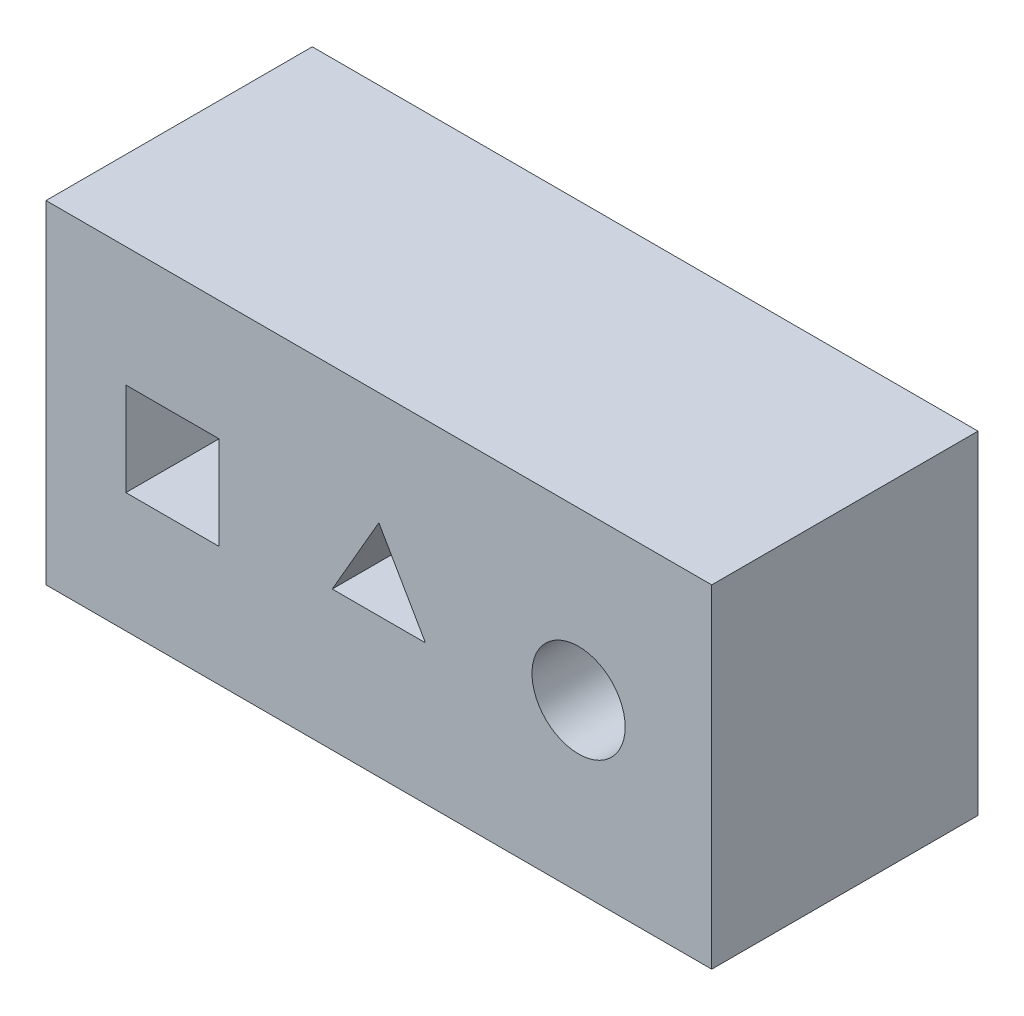
ISO-10303-21;
HEADER;
FILE_DESCRIPTION(('STEP AP214'),'2;1');
FILE_NAME('part.step','',(''),(''),'','','');
FILE_SCHEMA(('AUTOMOTIVE_DESIGN { 1 0 10303 214 1 1 1 1 }'));
ENDSEC;
DATA;
#1=APPLICATION_CONTEXT('core data for automotive mechanical design processes');
#2=APPLICATION_PROTOCOL_DEFINITION('international standard','automotive_design',2000,#1);
#3=PRODUCT_CONTEXT('',#1,'mechanical');
#4=PRODUCT('Part','Part','',(#3));
#5=PRODUCT_RELATED_PRODUCT_CATEGORY('part','',(#4));
#6=PRODUCT_DEFINITION_FORMATION('','',#4);
#7=PRODUCT_DEFINITION_CONTEXT('part definition',#1,'design');
#8=PRODUCT_DEFINITION('design','',#6,#7);
#9=PRODUCT_DEFINITION_SHAPE('','',#8);
#10=(LENGTH_UNIT() NAMED_UNIT(*) SI_UNIT(.MILLI.,.METRE.));
#11=(NAMED_UNIT(*) PLANE_ANGLE_UNIT() SI_UNIT($,.RADIAN.));
#12=(NAMED_UNIT(*) SI_UNIT($,.STERADIAN.) SOLID_ANGLE_UNIT());
#13=UNCERTAINTY_MEASURE_WITH_UNIT(LENGTH_MEASURE(1.E-05),#10,'distance_accuracy_value','');
#14=(GEOMETRIC_REPRESENTATION_CONTEXT(3) GLOBAL_UNCERTAINTY_ASSIGNED_CONTEXT((#13)) GLOBAL_UNIT_ASSIGNED_CONTEXT((#10,
#11,#12)) REPRESENTATION_CONTEXT('',''));
#15=CARTESIAN_POINT('',(0.,0.,0.));
#16=DIRECTION('',(0.,0.,1.));
#17=DIRECTION('',(1.,0.,0.));
#18=AXIS2_PLACEMENT_3D('',#15,#16,#17);
#19=CARTESIAN_POINT('',(0.,0.,100.));
#20=DIRECTION('',(0.,0.,1.));
#21=DIRECTION('',(1.,0.,0.));
#22=AXIS2_PLACEMENT_3D('',#19,#20,#21);
#23=PLANE('',#22);
#24=DIRECTION('',(0.,-1.,0.));
#25=VECTOR('',#24,1.);
#26=CARTESIAN_POINT('',(-125.,-62.5,100.));
#27=LINE('',#26,#25);
#28=CARTESIAN_POINT('',(-125.,62.5,100.));
#29=VERTEX_POINT('',#28);
#30=CARTESIAN_POINT('',(-125.,-62.5,100.));
#31=VERTEX_POINT('',#30);
#32=EDGE_CURVE('E204',#29,#31,#27,.T.);
#33=ORIENTED_EDGE('',*,*,#32,.T.);
#34=DIRECTION('',(1.,0.,0.));
#35=VECTOR('',#34,1.);
#36=CARTESIAN_POINT('',(125.,-62.5,100.));
#37=LINE('',#36,#35);
#38=CARTESIAN_POINT('',(125.,-62.5,100.));
#39=VERTEX_POINT('',#38);
#40=EDGE_CURVE('E92',#31,#39,#37,.T.);
#41=ORIENTED_EDGE('',*,*,#40,.T.);
#42=DIRECTION('',(0.,1.,0.));
#43=VECTOR('',#42,1.);
#44=CARTESIAN_POINT('',(125.,-62.5,100.));
#45=LINE('',#44,#43);
#46=CARTESIAN_POINT('',(125.,62.5,100.));
#47=VERTEX_POINT('',#46);
#48=EDGE_CURVE('E209',#39,#47,#45,.T.);
#49=ORIENTED_EDGE('',*,*,#48,.T.);
#50=DIRECTION('',(-1.,0.,0.));
#51=VECTOR('',#50,1.);
#52=CARTESIAN_POINT('',(125.,62.5,100.));
#53=LINE('',#52,#51);
#54=EDGE_CURVE('E61',#47,#29,#53,.T.);
#55=ORIENTED_EDGE('',*,*,#54,.T.);
#56=EDGE_LOOP('',(#33,#41,#49,#55));
#57=FACE_BOUND('',#56,.T.);
#58=CARTESIAN_POINT('',(74.9999999999999,0.,100.));
#59=DIRECTION('',(0.,0.,1.));
#60=DIRECTION('',(1.,0.,0.));
#61=AXIS2_PLACEMENT_3D('',#58,#59,#60);
#62=CIRCLE('',#61,17.5);
#63=CARTESIAN_POINT('',(92.4999999999999,0.,100.));
#64=VERTEX_POINT('',#63);
#65=EDGE_CURVE('E305',#64,#64,#62,.T.);
#66=ORIENTED_EDGE('',*,*,#65,.F.);
#67=EDGE_LOOP('',(#66));
#68=FACE_BOUND('',#67,.T.);
#69=DIRECTION('',(1.,0.,0.));
#70=VECTOR('',#69,1.);
#71=CARTESIAN_POINT('',(0.,17.5,100.));
#72=LINE('',#71,#70);
#73=CARTESIAN_POINT('',(-95.,17.5,100.));
#74=VERTEX_POINT('',#73);
#75=CARTESIAN_POINT('',(-60.,17.5,100.));
#76=VERTEX_POINT('',#75);
#77=EDGE_CURVE('E293',#74,#76,#72,.T.);
#78=ORIENTED_EDGE('',*,*,#77,.T.);
#79=DIRECTION('',(0.,-1.,0.));
#80=VECTOR('',#79,1.);
#81=CARTESIAN_POINT('',(-60.,0.,100.));
#82=LINE('',#81,#80);
#83=CARTESIAN_POINT('',(-60.,-17.5,100.));
#84=VERTEX_POINT('',#83);
#85=EDGE_CURVE('E289',#76,#84,#82,.T.);
#86=ORIENTED_EDGE('',*,*,#85,.T.);
#87=DIRECTION('',(1.,0.,0.));
#88=VECTOR('',#87,1.);
#89=CARTESIAN_POINT('',(0.,-17.5,100.));
#90=LINE('',#89,#88);
#91=CARTESIAN_POINT('',(-95.,-17.5,100.));
#92=VERTEX_POINT('',#91);
#93=EDGE_CURVE('E177',#92,#84,#90,.T.);
#94=ORIENTED_EDGE('',*,*,#93,.F.);
#95=DIRECTION('',(0.,-1.,0.));
#96=VECTOR('',#95,1.);
#97=CARTESIAN_POINT('',(-95.,0.,100.));
#98=LINE('',#97,#96);
#99=EDGE_CURVE('E182',#74,#92,#98,.T.);
#100=ORIENTED_EDGE('',*,*,#99,.F.);
#101=EDGE_LOOP('',(#78,#86,#94,#100));
#102=FACE_BOUND('',#101,.T.);
#103=DIRECTION('',(0.5,-0.866025403784439,0.));
#104=VECTOR('',#103,1.);
#105=CARTESIAN_POINT('',(8.75,5.05181485540923,100.));
#106=LINE('',#105,#104);
#107=CARTESIAN_POINT('',(0.,20.2072594216369,100.));
#108=VERTEX_POINT('',#107);
#109=CARTESIAN_POINT('',(17.5,-10.1036297108184,100.));
#110=VERTEX_POINT('',#109);
#111=EDGE_CURVE('E160',#108,#110,#106,.T.);
#112=ORIENTED_EDGE('',*,*,#111,.T.);
#113=DIRECTION('',(-1.,0.,0.));
#114=VECTOR('',#113,1.);
#115=CARTESIAN_POINT('',(0.,-10.1036297108184,100.));
#116=LINE('',#115,#114);
#117=CARTESIAN_POINT('',(-17.5,-10.1036297108184,100.));
#118=VERTEX_POINT('',#117);
#119=EDGE_CURVE('E284',#110,#118,#116,.T.);
#120=ORIENTED_EDGE('',*,*,#119,.T.);
#121=DIRECTION('',(0.5,0.866025403784439,0.));
#122=VECTOR('',#121,1.);
#123=CARTESIAN_POINT('',(-8.75,5.05181485540923,100.));
#124=LINE('',#123,#122);
#125=EDGE_CURVE('E148',#118,#108,#124,.T.);
#126=ORIENTED_EDGE('',*,*,#125,.T.);
#127=EDGE_LOOP('',(#112,#120,#126));
#128=FACE_BOUND('',#127,.T.);
#129=ADVANCED_FACE('F43',(#57,#68,#102,#128),#23,.T.);
#130=CARTESIAN_POINT('',(0.,0.,0.));
#131=DIRECTION('',(0.,0.,1.));
#132=DIRECTION('',(1.,0.,0.));
#133=AXIS2_PLACEMENT_3D('',#130,#131,#132);
#134=PLANE('',#133);
#135=DIRECTION('',(0.,-1.,0.));
#136=VECTOR('',#135,1.);
#137=CARTESIAN_POINT('',(-125.,-62.5,0.));
#138=LINE('',#137,#136);
#139=CARTESIAN_POINT('',(-125.,62.5,0.));
#140=VERTEX_POINT('',#139);
#141=CARTESIAN_POINT('',(-125.,-62.5,0.));
#142=VERTEX_POINT('',#141);
#143=EDGE_CURVE('E203',#140,#142,#138,.T.);
#144=ORIENTED_EDGE('',*,*,#143,.F.);
#145=DIRECTION('',(-1.,0.,0.));
#146=VECTOR('',#145,1.);
#147=CARTESIAN_POINT('',(125.,62.5,0.));
#148=LINE('',#147,#146);
#149=CARTESIAN_POINT('',(125.,62.5,0.));
#150=VERTEX_POINT('',#149);
#151=EDGE_CURVE('E85',#150,#140,#148,.T.);
#152=ORIENTED_EDGE('',*,*,#151,.F.);
#153=DIRECTION('',(0.,1.,0.));
#154=VECTOR('',#153,1.);
#155=CARTESIAN_POINT('',(125.,-62.5,0.));
#156=LINE('',#155,#154);
#157=CARTESIAN_POINT('',(125.,-62.5,0.));
#158=VERTEX_POINT('',#157);
#159=EDGE_CURVE('E79',#158,#150,#156,.T.);
#160=ORIENTED_EDGE('',*,*,#159,.F.);
#161=DIRECTION('',(1.,0.,0.));
#162=VECTOR('',#161,1.);
#163=CARTESIAN_POINT('',(125.,-62.5,0.));
#164=LINE('',#163,#162);
#165=EDGE_CURVE('E218',#142,#158,#164,.T.);
#166=ORIENTED_EDGE('',*,*,#165,.F.);
#167=EDGE_LOOP('',(#144,#152,#160,#166));
#168=FACE_BOUND('',#167,.T.);
#169=DIRECTION('',(-0.5,0.866025403784439,0.));
#170=VECTOR('',#169,1.);
#171=CARTESIAN_POINT('',(8.75,5.05181485540923,0.));
#172=LINE('',#171,#170);
#173=CARTESIAN_POINT('',(17.5,-10.1036297108184,0.));
#174=VERTEX_POINT('',#173);
#175=CARTESIAN_POINT('',(0.,20.2072594216369,0.));
#176=VERTEX_POINT('',#175);
#177=EDGE_CURVE('E136',#174,#176,#172,.T.);
#178=ORIENTED_EDGE('',*,*,#177,.T.);
#179=DIRECTION('',(-0.5,-0.866025403784439,0.));
#180=VECTOR('',#179,1.);
#181=CARTESIAN_POINT('',(-8.75,5.05181485540923,0.));
#182=LINE('',#181,#180);
#183=CARTESIAN_POINT('',(-17.5,-10.1036297108184,-1.11022302462516E-13));
#184=VERTEX_POINT('',#183);
#185=EDGE_CURVE('E140',#176,#184,#182,.T.);
#186=ORIENTED_EDGE('',*,*,#185,.T.);
#187=DIRECTION('',(1.,0.,0.));
#188=VECTOR('',#187,1.);
#189=CARTESIAN_POINT('',(0.,-10.1036297108184,0.));
#190=LINE('',#189,#188);
#191=EDGE_CURVE('E143',#184,#174,#190,.T.);
#192=ORIENTED_EDGE('',*,*,#191,.T.);
#193=EDGE_LOOP('',(#178,#186,#192));
#194=FACE_BOUND('',#193,.T.);
#195=DIRECTION('',(-1.,0.,0.));
#196=VECTOR('',#195,1.);
#197=CARTESIAN_POINT('',(0.,17.5,0.));
#198=LINE('',#197,#196);
#199=CARTESIAN_POINT('',(-60.,17.5,0.));
#200=VERTEX_POINT('',#199);
#201=CARTESIAN_POINT('',(-95.,17.5,0.));
#202=VERTEX_POINT('',#201);
#203=EDGE_CURVE('E191',#200,#202,#198,.T.);
#204=ORIENTED_EDGE('',*,*,#203,.T.);
#205=DIRECTION('',(0.,1.,0.));
#206=VECTOR('',#205,1.);
#207=CARTESIAN_POINT('',(-95.,0.,0.));
#208=LINE('',#207,#206);
#209=CARTESIAN_POINT('',(-95.,-17.5,0.));
#210=VERTEX_POINT('',#209);
#211=EDGE_CURVE('E168',#210,#202,#208,.T.);
#212=ORIENTED_EDGE('',*,*,#211,.F.);
#213=DIRECTION('',(-1.,0.,0.));
#214=VECTOR('',#213,1.);
#215=CARTESIAN_POINT('',(0.,-17.5,0.));
#216=LINE('',#215,#214);
#217=CARTESIAN_POINT('',(-60.,-17.5,-1.11022302462516E-13));
#218=VERTEX_POINT('',#217);
#219=EDGE_CURVE('E186',#218,#210,#216,.T.);
#220=ORIENTED_EDGE('',*,*,#219,.F.);
#221=DIRECTION('',(0.,1.,0.));
#222=VECTOR('',#221,1.);
#223=CARTESIAN_POINT('',(-60.,0.,0.));
#224=LINE('',#223,#222);
#225=EDGE_CURVE('E194',#218,#200,#224,.T.);
#226=ORIENTED_EDGE('',*,*,#225,.T.);
#227=EDGE_LOOP('',(#204,#212,#220,#226));
#228=FACE_BOUND('',#227,.T.);
#229=CARTESIAN_POINT('',(74.9999999999999,0.,0.));
#230=DIRECTION('',(0.,0.,1.));
#231=DIRECTION('',(1.,0.,0.));
#232=AXIS2_PLACEMENT_3D('',#229,#230,#231);
#233=CIRCLE('',#232,17.5);
#234=CARTESIAN_POINT('',(92.4999999999999,0.,0.));
#235=VERTEX_POINT('',#234);
#236=EDGE_CURVE('E173',#235,#235,#233,.F.);
#237=ORIENTED_EDGE('',*,*,#236,.F.);
#238=EDGE_LOOP('',(#237));
#239=FACE_BOUND('',#238,.T.);
#240=ADVANCED_FACE('F138',(#168,#194,#228,#239),#134,.F.);
#241=CARTESIAN_POINT('',(-125.,-62.5,100.));
#242=DIRECTION('',(1.,0.,0.));
#243=DIRECTION('',(0.,0.,-1.));
#244=AXIS2_PLACEMENT_3D('',#241,#242,#243);
#245=PLANE('',#244);
#246=ORIENTED_EDGE('',*,*,#143,.T.);
#247=DIRECTION('',(0.,0.,-1.));
#248=VECTOR('',#247,1.);
#249=CARTESIAN_POINT('',(-125.,-62.5,100.));
#250=LINE('',#249,#248);
#251=EDGE_CURVE('E11',#31,#142,#250,.T.);
#252=ORIENTED_EDGE('',*,*,#251,.F.);
#253=ORIENTED_EDGE('',*,*,#32,.F.);
#254=DIRECTION('',(0.,0.,-1.));
#255=VECTOR('',#254,1.);
#256=CARTESIAN_POINT('',(-125.,62.5,100.));
#257=LINE('',#256,#255);
#258=EDGE_CURVE('E214',#29,#140,#257,.T.);
#259=ORIENTED_EDGE('',*,*,#258,.T.);
#260=EDGE_LOOP('',(#246,#252,#253,#259));
#261=FACE_BOUND('',#260,.T.);
#262=ADVANCED_FACE('F45',(#261),#245,.F.);
#263=CARTESIAN_POINT('',(125.,-62.5,100.));
#264=DIRECTION('',(0.,1.,0.));
#265=DIRECTION('',(-1.,0.,0.));
#266=AXIS2_PLACEMENT_3D('',#263,#264,#265);
#267=PLANE('',#266);
#268=ORIENTED_EDGE('',*,*,#165,.T.);
#269=DIRECTION('',(0.,0.,-1.));
#270=VECTOR('',#269,1.);
#271=CARTESIAN_POINT('',(125.,-62.5,100.));
#272=LINE('',#271,#270);
#273=EDGE_CURVE('E53',#39,#158,#272,.T.);
#274=ORIENTED_EDGE('',*,*,#273,.F.);
#275=ORIENTED_EDGE('',*,*,#40,.F.);
#276=ORIENTED_EDGE('',*,*,#251,.T.);
#277=EDGE_LOOP('',(#268,#274,#275,#276));
#278=FACE_BOUND('',#277,.T.);
#279=ADVANCED_FACE('F245',(#278),#267,.F.);
#280=CARTESIAN_POINT('',(125.,-62.5,100.));
#281=DIRECTION('',(-1.,0.,0.));
#282=DIRECTION('',(0.,0.,1.));
#283=AXIS2_PLACEMENT_3D('',#280,#281,#282);
#284=PLANE('',#283);
#285=ORIENTED_EDGE('',*,*,#159,.T.);
#286=DIRECTION('',(0.,0.,-1.));
#287=VECTOR('',#286,1.);
#288=CARTESIAN_POINT('',(125.,62.5,100.));
#289=LINE('',#288,#287);
#290=EDGE_CURVE('E227',#47,#150,#289,.T.);
#291=ORIENTED_EDGE('',*,*,#290,.F.);
#292=ORIENTED_EDGE('',*,*,#48,.F.);
#293=ORIENTED_EDGE('',*,*,#273,.T.);
#294=EDGE_LOOP('',(#285,#291,#292,#293));
#295=FACE_BOUND('',#294,.T.);
#296=ADVANCED_FACE('F231',(#295),#284,.F.);
#297=CARTESIAN_POINT('',(125.,62.5,100.));
#298=DIRECTION('',(0.,-1.,0.));
#299=DIRECTION('',(1.,0.,0.));
#300=AXIS2_PLACEMENT_3D('',#297,#298,#299);
#301=PLANE('',#300);
#302=ORIENTED_EDGE('',*,*,#151,.T.);
#303=ORIENTED_EDGE('',*,*,#258,.F.);
#304=ORIENTED_EDGE('',*,*,#54,.F.);
#305=ORIENTED_EDGE('',*,*,#290,.T.);
#306=EDGE_LOOP('',(#302,#303,#304,#305));
#307=FACE_BOUND('',#306,.T.);
#308=ADVANCED_FACE('F237',(#307),#301,.F.);
#309=CARTESIAN_POINT('',(8.75,5.05181485540923,-279.508497187474));
#310=DIRECTION('',(-0.866025403784439,-0.5,0.));
#311=DIRECTION('',(0.5,-0.866025403784439,0.));
#312=AXIS2_PLACEMENT_3D('',#309,#310,#311);
#313=PLANE('',#312);
#314=ORIENTED_EDGE('',*,*,#177,.F.);
#315=DIRECTION('',(0.,0.,1.));
#316=VECTOR('',#315,1.);
#317=CARTESIAN_POINT('',(17.5,-10.1036297108184,-279.508497187474));
#318=LINE('',#317,#316);
#319=EDGE_CURVE('E164',#174,#110,#318,.T.);
#320=ORIENTED_EDGE('',*,*,#319,.T.);
#321=ORIENTED_EDGE('',*,*,#111,.F.);
#322=DIRECTION('',(0.,0.,1.));
#323=VECTOR('',#322,1.);
#324=CARTESIAN_POINT('',(0.,20.2072594216369,-279.508497187474));
#325=LINE('',#324,#323);
#326=EDGE_CURVE('E153',#176,#108,#325,.T.);
#327=ORIENTED_EDGE('',*,*,#326,.F.);
#328=EDGE_LOOP('',(#314,#320,#321,#327));
#329=FACE_BOUND('',#328,.T.);
#330=ADVANCED_FACE('F158',(#329),#313,.T.);
#331=CARTESIAN_POINT('',(-8.75,5.05181485540923,-279.508497187474));
#332=DIRECTION('',(0.866025403784439,-0.5,0.));
#333=DIRECTION('',(0.5,0.866025403784439,0.));
#334=AXIS2_PLACEMENT_3D('',#331,#332,#333);
#335=PLANE('',#334);
#336=ORIENTED_EDGE('',*,*,#185,.F.);
#337=ORIENTED_EDGE('',*,*,#326,.T.);
#338=ORIENTED_EDGE('',*,*,#125,.F.);
#339=DIRECTION('',(0.,0.,1.));
#340=VECTOR('',#339,1.);
#341=CARTESIAN_POINT('',(-17.5,-10.1036297108184,-279.508497187474));
#342=LINE('',#341,#340);
#343=EDGE_CURVE('E155',#184,#118,#342,.T.);
#344=ORIENTED_EDGE('',*,*,#343,.F.);
#345=EDGE_LOOP('',(#336,#337,#338,#344));
#346=FACE_BOUND('',#345,.T.);
#347=ADVANCED_FACE('F151',(#346),#335,.T.);
#348=CARTESIAN_POINT('',(0.,17.5,-279.508497187474));
#349=DIRECTION('',(0.,-1.,0.));
#350=DIRECTION('',(0.,0.,-1.));
#351=AXIS2_PLACEMENT_3D('',#348,#349,#350);
#352=PLANE('',#351);
#353=ORIENTED_EDGE('',*,*,#203,.F.);
#354=DIRECTION('',(0.,0.,1.));
#355=VECTOR('',#354,1.);
#356=CARTESIAN_POINT('',(-60.,17.5,-279.508497187474));
#357=LINE('',#356,#355);
#358=EDGE_CURVE('E163',#200,#76,#357,.T.);
#359=ORIENTED_EDGE('',*,*,#358,.T.);
#360=ORIENTED_EDGE('',*,*,#77,.F.);
#361=DIRECTION('',(0.,0.,1.));
#362=VECTOR('',#361,1.);
#363=CARTESIAN_POINT('',(-95.,17.5,-279.508497187474));
#364=LINE('',#363,#362);
#365=EDGE_CURVE('E179',#202,#74,#364,.T.);
#366=ORIENTED_EDGE('',*,*,#365,.F.);
#367=EDGE_LOOP('',(#353,#359,#360,#366));
#368=FACE_BOUND('',#367,.T.);
#369=ADVANCED_FACE('F260',(#368),#352,.T.);
#370=CARTESIAN_POINT('',(-95.,0.,-279.508497187474));
#371=DIRECTION('',(-1.,0.,0.));
#372=DIRECTION('',(0.,0.,1.));
#373=AXIS2_PLACEMENT_3D('',#370,#371,#372);
#374=PLANE('',#373);
#375=DIRECTION('',(0.,0.,1.));
#376=VECTOR('',#375,1.);
#377=CARTESIAN_POINT('',(-95.,-17.5,-279.508497187474));
#378=LINE('',#377,#376);
#379=EDGE_CURVE('E183',#210,#92,#378,.T.);
#380=ORIENTED_EDGE('',*,*,#379,.F.);
#381=ORIENTED_EDGE('',*,*,#211,.T.);
#382=ORIENTED_EDGE('',*,*,#365,.T.);
#383=ORIENTED_EDGE('',*,*,#99,.T.);
#384=EDGE_LOOP('',(#380,#381,#382,#383));
#385=FACE_BOUND('',#384,.T.);
#386=ADVANCED_FACE('F263',(#385),#374,.F.);
#387=CARTESIAN_POINT('',(0.,-17.5,-279.508497187474));
#388=DIRECTION('',(0.,-1.,0.));
#389=DIRECTION('',(0.,0.,-1.));
#390=AXIS2_PLACEMENT_3D('',#387,#388,#389);
#391=PLANE('',#390);
#392=DIRECTION('',(0.,0.,1.));
#393=VECTOR('',#392,1.);
#394=CARTESIAN_POINT('',(-60.,-17.5,-279.508497187474));
#395=LINE('',#394,#393);
#396=EDGE_CURVE('E176',#218,#84,#395,.T.);
#397=ORIENTED_EDGE('',*,*,#396,.F.);
#398=ORIENTED_EDGE('',*,*,#219,.T.);
#399=ORIENTED_EDGE('',*,*,#379,.T.);
#400=ORIENTED_EDGE('',*,*,#93,.T.);
#401=EDGE_LOOP('',(#397,#398,#399,#400));
#402=FACE_BOUND('',#401,.T.);
#403=ADVANCED_FACE('F267',(#402),#391,.F.);
#404=CARTESIAN_POINT('',(0.,-10.1036297108184,-279.508497187474));
#405=DIRECTION('',(0.,1.,0.));
#406=DIRECTION('',(-1.,0.,0.));
#407=AXIS2_PLACEMENT_3D('',#404,#405,#406);
#408=PLANE('',#407);
#409=ORIENTED_EDGE('',*,*,#191,.F.);
#410=ORIENTED_EDGE('',*,*,#343,.T.);
#411=ORIENTED_EDGE('',*,*,#119,.F.);
#412=ORIENTED_EDGE('',*,*,#319,.F.);
#413=EDGE_LOOP('',(#409,#410,#411,#412));
#414=FACE_BOUND('',#413,.T.);
#415=ADVANCED_FACE('F271',(#414),#408,.T.);
#416=CARTESIAN_POINT('',(-60.,0.,-279.508497187474));
#417=DIRECTION('',(-1.,0.,0.));
#418=DIRECTION('',(0.,0.,1.));
#419=AXIS2_PLACEMENT_3D('',#416,#417,#418);
#420=PLANE('',#419);
#421=ORIENTED_EDGE('',*,*,#225,.F.);
#422=ORIENTED_EDGE('',*,*,#396,.T.);
#423=ORIENTED_EDGE('',*,*,#85,.F.);
#424=ORIENTED_EDGE('',*,*,#358,.F.);
#425=EDGE_LOOP('',(#421,#422,#423,#424));
#426=FACE_BOUND('',#425,.T.);
#427=ADVANCED_FACE('F258',(#426),#420,.T.);
#428=CARTESIAN_POINT('',(74.9999999999999,0.,-279.508497187474));
#429=DIRECTION('',(0.,0.,1.));
#430=DIRECTION('',(1.,0.,0.));
#431=AXIS2_PLACEMENT_3D('',#428,#429,#430);
#432=CYLINDRICAL_SURFACE('',#431,17.5);
#433=CARTESIAN_POINT('',(92.4999999999999,0.,0.));
#434=CARTESIAN_POINT('',(92.4999999999999,0.,1.04166666666661));
#435=CARTESIAN_POINT('',(92.4999999999999,0.,2.08333333333327));
#436=CARTESIAN_POINT('',(92.4999999999999,0.,4.1666666666666));
#437=CARTESIAN_POINT('',(92.4999999999999,0.,5.20833333333326));
#438=CARTESIAN_POINT('',(92.4999999999999,0.,7.2916666666666));
#439=CARTESIAN_POINT('',(92.4999999999999,0.,8.33333333333329));
#440=CARTESIAN_POINT('',(92.4999999999999,0.,10.4166666666666));
#441=CARTESIAN_POINT('',(92.4999999999999,0.,11.4583333333333));
#442=CARTESIAN_POINT('',(92.4999999999999,0.,13.5416666666666));
#443=CARTESIAN_POINT('',(92.4999999999999,0.,14.5833333333333));
#444=CARTESIAN_POINT('',(92.4999999999999,0.,16.6666666666666));
#445=CARTESIAN_POINT('',(92.4999999999999,0.,17.7083333333333));
#446=CARTESIAN_POINT('',(92.4999999999999,0.,19.7916666666667));
#447=CARTESIAN_POINT('',(92.4999999999999,0.,20.8333333333333));
#448=CARTESIAN_POINT('',(92.4999999999999,0.,22.9166666666666));
#449=CARTESIAN_POINT('',(92.4999999999999,0.,23.9583333333333));
#450=CARTESIAN_POINT('',(92.4999999999999,0.,26.0416666666666));
#451=CARTESIAN_POINT('',(92.4999999999999,0.,27.0833333333333));
#452=CARTESIAN_POINT('',(92.4999999999999,0.,29.1666666666666));
#453=CARTESIAN_POINT('',(92.4999999999999,0.,30.2083333333333));
#454=CARTESIAN_POINT('',(92.4999999999999,0.,32.2916666666666));
#455=CARTESIAN_POINT('',(92.4999999999999,0.,33.3333333333333));
#456=CARTESIAN_POINT('',(92.4999999999999,0.,35.4166666666667));
#457=CARTESIAN_POINT('',(92.4999999999999,0.,36.4583333333333));
#458=CARTESIAN_POINT('',(92.4999999999999,0.,38.5416666666666));
#459=CARTESIAN_POINT('',(92.4999999999999,0.,39.5833333333333));
#460=CARTESIAN_POINT('',(92.4999999999999,0.,41.6666666666667));
#461=CARTESIAN_POINT('',(92.4999999999999,0.,42.7083333333333));
#462=CARTESIAN_POINT('',(92.4999999999999,0.,44.7916666666667));
#463=CARTESIAN_POINT('',(92.4999999999999,0.,45.8333333333333));
#464=CARTESIAN_POINT('',(92.4999999999999,0.,47.9166666666667));
#465=CARTESIAN_POINT('',(92.4999999999999,0.,48.9583333333333));
#466=CARTESIAN_POINT('',(92.4999999999999,0.,51.0416666666667));
#467=CARTESIAN_POINT('',(92.4999999999999,0.,52.0833333333333));
#468=CARTESIAN_POINT('',(92.4999999999999,0.,54.1666666666666));
#469=CARTESIAN_POINT('',(92.4999999999999,0.,55.2083333333333));
#470=CARTESIAN_POINT('',(92.4999999999999,0.,57.2916666666667));
#471=CARTESIAN_POINT('',(92.4999999999999,0.,58.3333333333333));
#472=CARTESIAN_POINT('',(92.4999999999999,0.,60.4166666666667));
#473=CARTESIAN_POINT('',(92.4999999999999,0.,61.4583333333333));
#474=CARTESIAN_POINT('',(92.4999999999999,0.,63.5416666666667));
#475=CARTESIAN_POINT('',(92.4999999999999,0.,64.5833333333333));
#476=CARTESIAN_POINT('',(92.4999999999999,0.,66.6666666666667));
#477=CARTESIAN_POINT('',(92.4999999999999,0.,67.7083333333334));
#478=CARTESIAN_POINT('',(92.4999999999999,0.,69.7916666666667));
#479=CARTESIAN_POINT('',(92.4999999999999,0.,70.8333333333334));
#480=CARTESIAN_POINT('',(92.4999999999999,0.,72.9166666666667));
#481=CARTESIAN_POINT('',(92.4999999999999,0.,73.9583333333333));
#482=CARTESIAN_POINT('',(92.4999999999999,0.,76.0416666666667));
#483=CARTESIAN_POINT('',(92.4999999999999,0.,77.0833333333333));
#484=CARTESIAN_POINT('',(92.4999999999999,0.,79.1666666666667));
#485=CARTESIAN_POINT('',(92.4999999999999,0.,80.2083333333333));
#486=CARTESIAN_POINT('',(92.4999999999999,0.,82.2916666666667));
#487=CARTESIAN_POINT('',(92.4999999999999,0.,83.3333333333334));
#488=CARTESIAN_POINT('',(92.4999999999999,0.,85.4166666666667));
#489=CARTESIAN_POINT('',(92.4999999999999,0.,86.4583333333334));
#490=CARTESIAN_POINT('',(92.4999999999999,0.,88.5416666666667));
#491=CARTESIAN_POINT('',(92.4999999999999,0.,89.5833333333333));
#492=CARTESIAN_POINT('',(92.4999999999999,0.,91.6666666666667));
#493=CARTESIAN_POINT('',(92.4999999999999,0.,92.7083333333334));
#494=CARTESIAN_POINT('',(92.4999999999999,0.,94.7916666666667));
#495=CARTESIAN_POINT('',(92.4999999999999,0.,95.8333333333334));
#496=CARTESIAN_POINT('',(92.4999999999999,0.,97.9166666666667));
#497=CARTESIAN_POINT('',(92.4999999999999,0.,98.9583333333334));
#498=CARTESIAN_POINT('',(92.4999999999999,0.,100.));
#499=B_SPLINE_CURVE_WITH_KNOTS('',3,(#433,#434,#435,#436,#437,#438,#439,#440,#441,#442,#443,
#444,#445,#446,#447,#448,#449,#450,#451,#452,#453,#454,#455,#456,#457,#458,#459,#460,#461,#462,
#463,#464,#465,#466,#467,#468,#469,#470,#471,#472,#473,#474,#475,#476,#477,#478,#479,#480,#481,
#482,#483,#484,#485,#486,#487,#488,#489,#490,#491,#492,#493,#494,#495,#496,#497,#498),
.UNSPECIFIED.,.F.,.F.,(4,2,2,2,2,2,2,2,2,2,2,2,2,2,2,2,2,2,2,2,2,2,2,2,2,2,2,2,2,2,2,2,4),(0.,
3.12499999999999,6.24999999999998,9.37500000000002,12.5,15.625,18.75,21.875,25.,28.125,31.25,
34.375,37.5,40.625,43.7500000000001,46.8750000000001,50.,53.125,56.25,59.3750000000001,
62.5000000000001,65.625,68.7500000000001,71.8750000000001,75.0000000000001,78.1250000000001,
81.25,84.3750000000001,87.5000000000001,90.6250000000001,93.7500000000001,96.8750000000001,
100.),.UNSPECIFIED.);
#500=EDGE_CURVE('BSEAM255',#235,#64,#499,.T.);
#501=ORIENTED_EDGE('',*,*,#236,.T.);
#502=ORIENTED_EDGE('',*,*,#65,.T.);
#503=ORIENTED_EDGE('',*,*,#500,.T.);
#504=ORIENTED_EDGE('',*,*,#500,.F.);
#505=EDGE_LOOP('',(#501,#503,#502,#504));
#506=FACE_BOUND('',#505,.T.);
#507=ADVANCED_FACE('F255',(#506),#432,.F.);
#508=CLOSED_SHELL('',(#129,#240,#262,#279,#296,#308,#330,#347,#369,#386,#403,#415,#427,#507));
#509=MANIFOLD_SOLID_BREP('B2',#508);
#510=ADVANCED_BREP_SHAPE_REPRESENTATION('',(#18,#509),#14);
#511=SHAPE_DEFINITION_REPRESENTATION(#9,#510);
ENDSEC;
END-ISO-10303-21;
